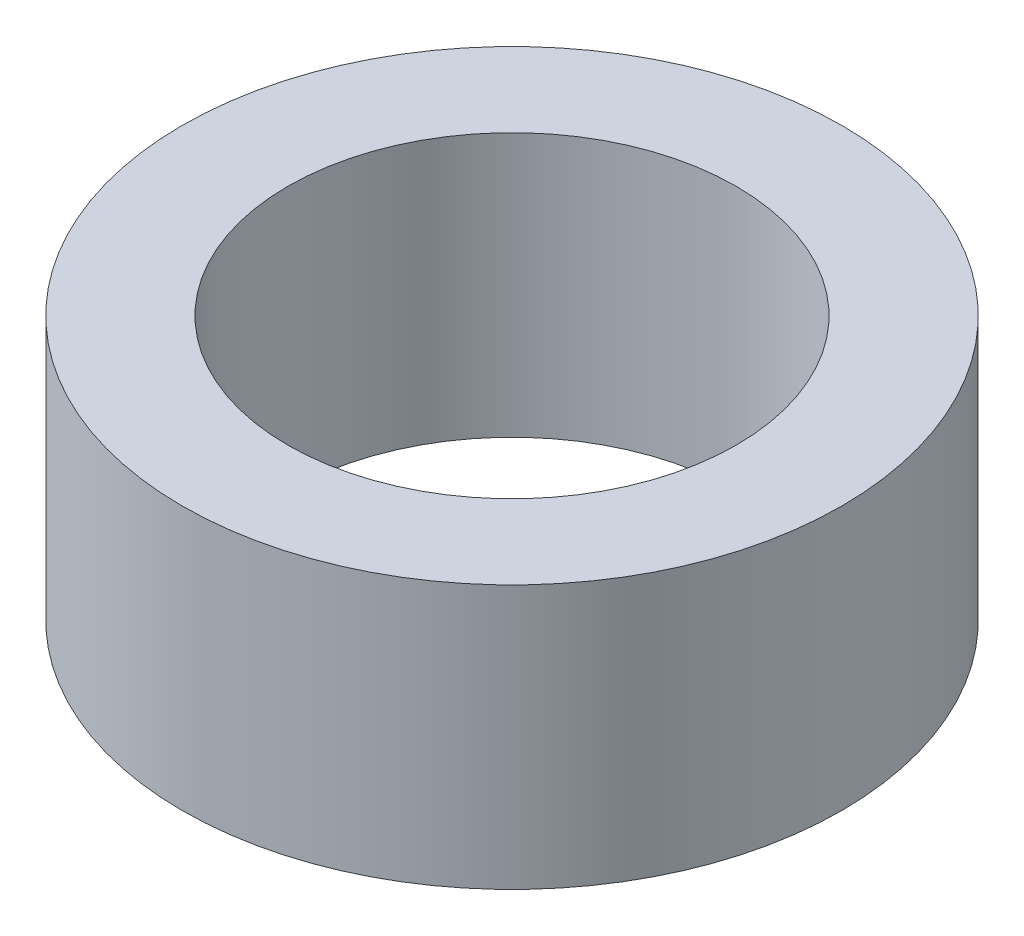
ISO-10303-21;
HEADER;
FILE_DESCRIPTION(('STEP AP214'),'2;1');
FILE_NAME('part.step','',(''),(''),'','','');
FILE_SCHEMA(('AUTOMOTIVE_DESIGN { 1 0 10303 214 1 1 1 1 }'));
ENDSEC;
DATA;
#1=APPLICATION_CONTEXT('core data for automotive mechanical design processes');
#2=APPLICATION_PROTOCOL_DEFINITION('international standard','automotive_design',2000,#1);
#3=PRODUCT_CONTEXT('',#1,'mechanical');
#4=PRODUCT('Part','Part','',(#3));
#5=PRODUCT_RELATED_PRODUCT_CATEGORY('part','',(#4));
#6=PRODUCT_DEFINITION_FORMATION('','',#4);
#7=PRODUCT_DEFINITION_CONTEXT('part definition',#1,'design');
#8=PRODUCT_DEFINITION('design','',#6,#7);
#9=PRODUCT_DEFINITION_SHAPE('','',#8);
#10=(LENGTH_UNIT() NAMED_UNIT(*) SI_UNIT(.MILLI.,.METRE.));
#11=(NAMED_UNIT(*) PLANE_ANGLE_UNIT() SI_UNIT($,.RADIAN.));
#12=(NAMED_UNIT(*) SI_UNIT($,.STERADIAN.) SOLID_ANGLE_UNIT());
#13=UNCERTAINTY_MEASURE_WITH_UNIT(LENGTH_MEASURE(1.E-05),#10,'distance_accuracy_value','');
#14=(GEOMETRIC_REPRESENTATION_CONTEXT(3) GLOBAL_UNCERTAINTY_ASSIGNED_CONTEXT((#13)) GLOBAL_UNIT_ASSIGNED_CONTEXT((#10,
#11,#12)) REPRESENTATION_CONTEXT('',''));
#15=CARTESIAN_POINT('',(0.,0.,0.));
#16=DIRECTION('',(0.,0.,1.));
#17=DIRECTION('',(1.,0.,0.));
#18=AXIS2_PLACEMENT_3D('',#15,#16,#17);
#19=CARTESIAN_POINT('',(0.,5.,0.));
#20=DIRECTION('',(0.,1.,0.));
#21=DIRECTION('',(0.,0.,1.));
#22=AXIS2_PLACEMENT_3D('',#19,#20,#21);
#23=PLANE('',#22);
#24=CARTESIAN_POINT('',(0.,5.,0.));
#25=DIRECTION('',(0.,1.,0.));
#26=DIRECTION('',(0.,0.,1.));
#27=AXIS2_PLACEMENT_3D('',#24,#25,#26);
#28=CIRCLE('',#27,6.25);
#29=CARTESIAN_POINT('',(0.,5.,6.25));
#30=VERTEX_POINT('',#29);
#31=EDGE_CURVE('E10',#30,#30,#28,.T.);
#32=ORIENTED_EDGE('',*,*,#31,.T.);
#33=EDGE_LOOP('',(#32));
#34=FACE_BOUND('',#33,.T.);
#35=CARTESIAN_POINT('',(0.,5.,0.));
#36=DIRECTION('',(0.,1.,0.));
#37=DIRECTION('',(0.,0.,1.));
#38=AXIS2_PLACEMENT_3D('',#35,#36,#37);
#39=CIRCLE('',#38,4.25);
#40=CARTESIAN_POINT('',(0.,5.,4.25));
#41=VERTEX_POINT('',#40);
#42=EDGE_CURVE('E50',#41,#41,#39,.T.);
#43=ORIENTED_EDGE('',*,*,#42,.F.);
#44=EDGE_LOOP('',(#43));
#45=FACE_BOUND('',#44,.T.);
#46=ADVANCED_FACE('F37',(#34,#45),#23,.T.);
#47=CARTESIAN_POINT('',(0.,0.,0.));
#48=DIRECTION('',(0.,1.,0.));
#49=DIRECTION('',(0.,0.,1.));
#50=AXIS2_PLACEMENT_3D('',#47,#48,#49);
#51=PLANE('',#50);
#52=CARTESIAN_POINT('',(0.,0.,0.));
#53=DIRECTION('',(0.,1.,0.));
#54=DIRECTION('',(0.,0.,1.));
#55=AXIS2_PLACEMENT_3D('',#52,#53,#54);
#56=CIRCLE('',#55,6.25);
#57=CARTESIAN_POINT('',(0.,0.,6.25));
#58=VERTEX_POINT('',#57);
#59=EDGE_CURVE('E41',#58,#58,#56,.T.);
#60=ORIENTED_EDGE('',*,*,#59,.F.);
#61=EDGE_LOOP('',(#60));
#62=FACE_BOUND('',#61,.T.);
#63=CARTESIAN_POINT('',(0.,0.,0.));
#64=DIRECTION('',(0.,1.,0.));
#65=DIRECTION('',(0.,0.,1.));
#66=AXIS2_PLACEMENT_3D('',#63,#64,#65);
#67=CIRCLE('',#66,4.25);
#68=CARTESIAN_POINT('',(0.,0.,4.25));
#69=VERTEX_POINT('',#68);
#70=EDGE_CURVE('E52',#69,#69,#67,.T.);
#71=ORIENTED_EDGE('',*,*,#70,.T.);
#72=EDGE_LOOP('',(#71));
#73=FACE_BOUND('',#72,.T.);
#74=ADVANCED_FACE('F64',(#62,#73),#51,.F.);
#75=CARTESIAN_POINT('',(0.,5.,0.));
#76=DIRECTION('',(0.,-1.,0.));
#77=DIRECTION('',(0.,0.,-1.));
#78=AXIS2_PLACEMENT_3D('',#75,#76,#77);
#79=CYLINDRICAL_SURFACE('',#78,6.25);
#80=ORIENTED_EDGE('',*,*,#31,.F.);
#81=EDGE_LOOP('',(#80));
#82=FACE_BOUND('',#81,.T.);
#83=ORIENTED_EDGE('',*,*,#59,.T.);
#84=EDGE_LOOP('',(#83));
#85=FACE_BOUND('',#84,.T.);
#86=ADVANCED_FACE('F39',(#82,#85),#79,.T.);
#87=CARTESIAN_POINT('',(0.,5.,0.));
#88=DIRECTION('',(0.,-1.,0.));
#89=DIRECTION('',(0.,0.,-1.));
#90=AXIS2_PLACEMENT_3D('',#87,#88,#89);
#91=CYLINDRICAL_SURFACE('',#90,4.25);
#92=ORIENTED_EDGE('',*,*,#42,.T.);
#93=EDGE_LOOP('',(#92));
#94=FACE_BOUND('',#93,.T.);
#95=ORIENTED_EDGE('',*,*,#70,.F.);
#96=EDGE_LOOP('',(#95));
#97=FACE_BOUND('',#96,.T.);
#98=ADVANCED_FACE('F60',(#94,#97),#91,.F.);
#99=CLOSED_SHELL('',(#46,#74,#86,#98));
#100=MANIFOLD_SOLID_BREP('B2',#99);
#101=ADVANCED_BREP_SHAPE_REPRESENTATION('',(#18,#100),#14);
#102=SHAPE_DEFINITION_REPRESENTATION(#9,#101);
ENDSEC;
END-ISO-10303-21;
